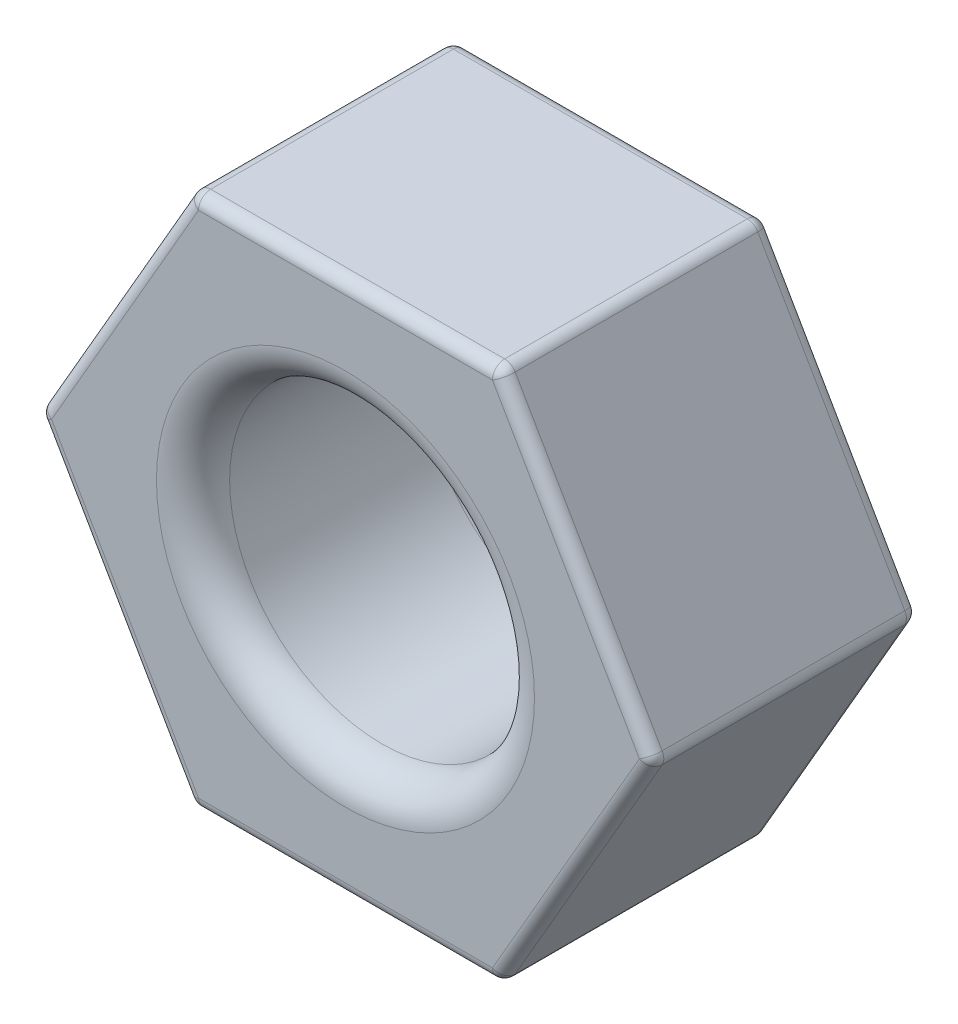
ISO-10303-21;
HEADER;
FILE_DESCRIPTION(('STEP AP214'),'2;1');
FILE_NAME('part.step','',(''),(''),'','','');
FILE_SCHEMA(('AUTOMOTIVE_DESIGN { 1 0 10303 214 1 1 1 1 }'));
ENDSEC;
DATA;
#1=APPLICATION_CONTEXT('core data for automotive mechanical design processes');
#2=APPLICATION_PROTOCOL_DEFINITION('international standard','automotive_design',2000,#1);
#3=PRODUCT_CONTEXT('',#1,'mechanical');
#4=PRODUCT('Part','Part','',(#3));
#5=PRODUCT_RELATED_PRODUCT_CATEGORY('part','',(#4));
#6=PRODUCT_DEFINITION_FORMATION('','',#4);
#7=PRODUCT_DEFINITION_CONTEXT('part definition',#1,'design');
#8=PRODUCT_DEFINITION('design','',#6,#7);
#9=PRODUCT_DEFINITION_SHAPE('','',#8);
#10=(LENGTH_UNIT() NAMED_UNIT(*) SI_UNIT(.MILLI.,.METRE.));
#11=(NAMED_UNIT(*) PLANE_ANGLE_UNIT() SI_UNIT($,.RADIAN.));
#12=(NAMED_UNIT(*) SI_UNIT($,.STERADIAN.) SOLID_ANGLE_UNIT());
#13=UNCERTAINTY_MEASURE_WITH_UNIT(LENGTH_MEASURE(1.E-05),#10,'distance_accuracy_value','');
#14=(GEOMETRIC_REPRESENTATION_CONTEXT(3) GLOBAL_UNCERTAINTY_ASSIGNED_CONTEXT((#13)) GLOBAL_UNIT_ASSIGNED_CONTEXT((#10,
#11,#12)) REPRESENTATION_CONTEXT('',''));
#15=CARTESIAN_POINT('',(0.,0.,0.));
#16=DIRECTION('',(0.,0.,1.));
#17=DIRECTION('',(1.,0.,0.));
#18=AXIS2_PLACEMENT_3D('',#15,#16,#17);
#19=CARTESIAN_POINT('',(0.,0.,5.5626));
#20=DIRECTION('',(0.,0.,1.));
#21=DIRECTION('',(1.,0.,0.));
#22=AXIS2_PLACEMENT_3D('',#19,#20,#21);
#23=PLANE('',#22);
#24=CARTESIAN_POINT('',(0.,0.,5.5626));
#25=DIRECTION('',(0.,0.,1.));
#26=DIRECTION('',(1.,0.,0.));
#27=AXIS2_PLACEMENT_3D('',#24,#25,#26);
#28=CIRCLE('',#27,3.937);
#29=CARTESIAN_POINT('',(3.937,0.,5.5626));
#30=VERTEX_POINT('',#29);
#31=EDGE_CURVE('E41',#30,#30,#28,.F.);
#32=ORIENTED_EDGE('',*,*,#31,.T.);
#33=EDGE_LOOP('',(#32));
#34=FACE_BOUND('',#33,.T.);
#35=DIRECTION('',(1.,0.,0.));
#36=VECTOR('',#35,1.);
#37=CARTESIAN_POINT('',(3.20790243318485,-5.30225000000001,5.5626));
#38=LINE('',#37,#36);
#39=CARTESIAN_POINT('',(-3.06125546481072,-5.30224999999999,5.5626));
#40=VERTEX_POINT('',#39);
#41=CARTESIAN_POINT('',(3.06125546481068,-5.30225000000001,5.5626));
#42=VERTEX_POINT('',#41);
#43=EDGE_CURVE('E48',#40,#42,#38,.T.);
#44=ORIENTED_EDGE('',*,*,#43,.T.);
#45=DIRECTION('',(0.500000000000001,0.866025403784438,0.));
#46=VECTOR('',#45,1.);
#47=CARTESIAN_POINT('',(6.19583441380847,0.127,5.5626));
#48=LINE('',#47,#46);
#49=CARTESIAN_POINT('',(6.12251092962139,0.,5.5626));
#50=VERTEX_POINT('',#49);
#51=EDGE_CURVE('E272',#42,#50,#48,.T.);
#52=ORIENTED_EDGE('',*,*,#51,.T.);
#53=DIRECTION('',(-0.499999999999995,0.866025403784442,0.));
#54=VECTOR('',#53,1.);
#55=CARTESIAN_POINT('',(2.98793198062368,5.42924999999997,5.5626));
#56=LINE('',#55,#54);
#57=CARTESIAN_POINT('',(3.06125546481076,5.30224999999997,5.5626));
#58=VERTEX_POINT('',#57);
#59=EDGE_CURVE('E400',#50,#58,#56,.T.);
#60=ORIENTED_EDGE('',*,*,#59,.T.);
#61=DIRECTION('',(-1.,0.,0.));
#62=VECTOR('',#61,1.);
#63=CARTESIAN_POINT('',(-3.20790243318481,5.30225000000004,5.5626));
#64=LINE('',#63,#62);
#65=CARTESIAN_POINT('',(-3.06125546481065,5.30225000000003,5.5626));
#66=VERTEX_POINT('',#65);
#67=EDGE_CURVE('E402',#58,#66,#64,.T.);
#68=ORIENTED_EDGE('',*,*,#67,.T.);
#69=DIRECTION('',(-0.500000000000008,-0.866025403784434,0.));
#70=VECTOR('',#69,1.);
#71=CARTESIAN_POINT('',(-6.19583441380848,-0.126999999999954,5.5626));
#72=LINE('',#71,#70);
#73=CARTESIAN_POINT('',(-6.12251092962139,0.,5.5626));
#74=VERTEX_POINT('',#73);
#75=EDGE_CURVE('E404',#66,#74,#72,.T.);
#76=ORIENTED_EDGE('',*,*,#75,.T.);
#77=DIRECTION('',(0.499999999999995,-0.866025403784442,0.));
#78=VECTOR('',#77,1.);
#79=CARTESIAN_POINT('',(-2.98793198062364,-5.42924999999999,5.5626));
#80=LINE('',#79,#78);
#81=EDGE_CURVE('E53',#74,#40,#80,.T.);
#82=ORIENTED_EDGE('',*,*,#81,.T.);
#83=EDGE_LOOP('',(#44,#52,#60,#68,#76,#82));
#84=FACE_BOUND('',#83,.T.);
#85=ADVANCED_FACE('F33',(#34,#84),#23,.T.);
#86=CARTESIAN_POINT('',(0.,0.,0.));
#87=DIRECTION('',(0.,0.,1.));
#88=DIRECTION('',(1.,0.,0.));
#89=AXIS2_PLACEMENT_3D('',#86,#87,#88);
#90=PLANE('',#89);
#91=CARTESIAN_POINT('',(0.,0.,0.));
#92=DIRECTION('',(0.,0.,1.));
#93=DIRECTION('',(1.,0.,0.));
#94=AXIS2_PLACEMENT_3D('',#91,#92,#93);
#95=CIRCLE('',#94,3.937);
#96=CARTESIAN_POINT('',(3.937,0.,0.));
#97=VERTEX_POINT('',#96);
#98=EDGE_CURVE('E11',#97,#97,#95,.T.);
#99=ORIENTED_EDGE('',*,*,#98,.T.);
#100=EDGE_LOOP('',(#99));
#101=FACE_BOUND('',#100,.T.);
#102=DIRECTION('',(1.,0.,0.));
#103=VECTOR('',#102,1.);
#104=CARTESIAN_POINT('',(0.,-5.30225,0.));
#105=LINE('',#104,#103);
#106=CARTESIAN_POINT('',(3.06125546481068,-5.30225000000001,0.));
#107=VERTEX_POINT('',#106);
#108=CARTESIAN_POINT('',(-3.06125546481072,-5.30224999999999,0.));
#109=VERTEX_POINT('',#108);
#110=EDGE_CURVE('E303',#107,#109,#105,.F.);
#111=ORIENTED_EDGE('',*,*,#110,.T.);
#112=DIRECTION('',(0.499999999999995,-0.866025403784442,0.));
#113=VECTOR('',#112,1.);
#114=CARTESIAN_POINT('',(-4.59188319721606,-2.65112499999997,0.));
#115=LINE('',#114,#113);
#116=CARTESIAN_POINT('',(-6.12251092962139,0.,0.));
#117=VERTEX_POINT('',#116);
#118=EDGE_CURVE('E306',#109,#117,#115,.F.);
#119=ORIENTED_EDGE('',*,*,#118,.T.);
#120=DIRECTION('',(-0.500000000000008,-0.866025403784434,0.));
#121=VECTOR('',#120,1.);
#122=CARTESIAN_POINT('',(-4.59188319721602,2.65112500000004,0.));
#123=LINE('',#122,#121);
#124=CARTESIAN_POINT('',(-3.06125546481065,5.30225000000003,0.));
#125=VERTEX_POINT('',#124);
#126=EDGE_CURVE('E346',#117,#125,#123,.F.);
#127=ORIENTED_EDGE('',*,*,#126,.T.);
#128=DIRECTION('',(-1.,0.,0.));
#129=VECTOR('',#128,1.);
#130=CARTESIAN_POINT('',(0.,5.30225,0.));
#131=LINE('',#130,#129);
#132=CARTESIAN_POINT('',(3.06125546481076,5.30224999999997,0.));
#133=VERTEX_POINT('',#132);
#134=EDGE_CURVE('E350',#125,#133,#131,.F.);
#135=ORIENTED_EDGE('',*,*,#134,.T.);
#136=DIRECTION('',(-0.499999999999995,0.866025403784442,0.));
#137=VECTOR('',#136,1.);
#138=CARTESIAN_POINT('',(4.59188319721608,2.65112499999998,0.));
#139=LINE('',#138,#137);
#140=CARTESIAN_POINT('',(6.12251092962139,0.,0.));
#141=VERTEX_POINT('',#140);
#142=EDGE_CURVE('E352',#133,#141,#139,.F.);
#143=ORIENTED_EDGE('',*,*,#142,.T.);
#144=DIRECTION('',(0.500000000000001,0.866025403784438,0.));
#145=VECTOR('',#144,1.);
#146=CARTESIAN_POINT('',(4.59188319721604,-2.65112500000001,0.));
#147=LINE('',#146,#145);
#148=EDGE_CURVE('E308',#141,#107,#147,.F.);
#149=ORIENTED_EDGE('',*,*,#148,.T.);
#150=EDGE_LOOP('',(#111,#119,#127,#135,#143,#149));
#151=FACE_BOUND('',#150,.T.);
#152=ADVANCED_FACE('F296',(#101,#151),#90,.F.);
#153=CARTESIAN_POINT('',(6.41580486636972,0.,5.5626));
#154=DIRECTION('',(-0.866025403784441,-0.499999999999995,0.));
#155=DIRECTION('',(0.499999999999995,-0.866025403784442,0.));
#156=AXIS2_PLACEMENT_3D('',#153,#154,#155);
#157=PLANE('',#156);
#158=DIRECTION('',(0.,0.,-1.));
#159=VECTOR('',#158,1.);
#160=CARTESIAN_POINT('',(6.34248138218264,0.126999999999999,5.5626));
#161=LINE('',#160,#159);
#162=CARTESIAN_POINT('',(6.34248138218264,0.126999999999999,5.3086));
#163=VERTEX_POINT('',#162);
#164=CARTESIAN_POINT('',(6.34248138218264,0.126999999999999,0.254));
#165=VERTEX_POINT('',#164);
#166=EDGE_CURVE('E375',#163,#165,#161,.T.);
#167=ORIENTED_EDGE('',*,*,#166,.T.);
#168=DIRECTION('',(-0.499999999999995,0.866025403784442,0.));
#169=VECTOR('',#168,1.);
#170=CARTESIAN_POINT('',(6.41580486636972,0.,0.254));
#171=LINE('',#170,#169);
#172=CARTESIAN_POINT('',(3.28122591737201,5.42924999999997,0.254));
#173=VERTEX_POINT('',#172);
#174=EDGE_CURVE('E379',#165,#173,#171,.T.);
#175=ORIENTED_EDGE('',*,*,#174,.T.);
#176=DIRECTION('',(0.,0.,-1.));
#177=VECTOR('',#176,1.);
#178=CARTESIAN_POINT('',(3.28122591737201,5.42924999999997,5.5626));
#179=LINE('',#178,#177);
#180=CARTESIAN_POINT('',(3.28122591737201,5.42924999999997,5.3086));
#181=VERTEX_POINT('',#180);
#182=EDGE_CURVE('E377',#173,#181,#179,.F.);
#183=ORIENTED_EDGE('',*,*,#182,.T.);
#184=DIRECTION('',(-0.499999999999995,0.866025403784442,0.));
#185=VECTOR('',#184,1.);
#186=CARTESIAN_POINT('',(6.41580486636972,0.,5.3086));
#187=LINE('',#186,#185);
#188=EDGE_CURVE('E373',#181,#163,#187,.F.);
#189=ORIENTED_EDGE('',*,*,#188,.T.);
#190=EDGE_LOOP('',(#167,#175,#183,#189));
#191=FACE_BOUND('',#190,.T.);
#192=ADVANCED_FACE('F299',(#191),#157,.F.);
#193=CARTESIAN_POINT('',(3.20790243318493,5.55624999999997,5.5626));
#194=DIRECTION('',(0.,-1.,0.));
#195=DIRECTION('',(1.,0.,0.));
#196=AXIS2_PLACEMENT_3D('',#193,#194,#195);
#197=PLANE('',#196);
#198=DIRECTION('',(0.,0.,-1.));
#199=VECTOR('',#198,1.);
#200=CARTESIAN_POINT('',(3.06125546481076,5.55624999999997,5.5626));
#201=LINE('',#200,#199);
#202=CARTESIAN_POINT('',(3.06125546481076,5.55624999999997,5.3086));
#203=VERTEX_POINT('',#202);
#204=CARTESIAN_POINT('',(3.06125546481076,5.55624999999997,0.254));
#205=VERTEX_POINT('',#204);
#206=EDGE_CURVE('E384',#203,#205,#201,.T.);
#207=ORIENTED_EDGE('',*,*,#206,.T.);
#208=DIRECTION('',(-1.,0.,0.));
#209=VECTOR('',#208,1.);
#210=CARTESIAN_POINT('',(3.20790243318493,5.55624999999997,0.254));
#211=LINE('',#210,#209);
#212=CARTESIAN_POINT('',(-3.06125546481064,5.55625000000003,0.254));
#213=VERTEX_POINT('',#212);
#214=EDGE_CURVE('E388',#205,#213,#211,.T.);
#215=ORIENTED_EDGE('',*,*,#214,.T.);
#216=DIRECTION('',(0.,0.,-1.));
#217=VECTOR('',#216,1.);
#218=CARTESIAN_POINT('',(-3.06125546481064,5.55625000000003,5.5626));
#219=LINE('',#218,#217);
#220=CARTESIAN_POINT('',(-3.06125546481064,5.55625000000003,5.3086));
#221=VERTEX_POINT('',#220);
#222=EDGE_CURVE('E386',#213,#221,#219,.F.);
#223=ORIENTED_EDGE('',*,*,#222,.T.);
#224=DIRECTION('',(-1.,0.,0.));
#225=VECTOR('',#224,1.);
#226=CARTESIAN_POINT('',(3.20790243318493,5.55624999999997,5.3086));
#227=LINE('',#226,#225);
#228=EDGE_CURVE('E382',#221,#203,#227,.F.);
#229=ORIENTED_EDGE('',*,*,#228,.T.);
#230=EDGE_LOOP('',(#207,#215,#223,#229));
#231=FACE_BOUND('',#230,.T.);
#232=ADVANCED_FACE('F495',(#231),#197,.F.);
#233=CARTESIAN_POINT('',(-3.20790243318481,5.55625000000003,5.5626));
#234=DIRECTION('',(0.866025403784434,-0.500000000000008,0.));
#235=DIRECTION('',(0.500000000000008,0.866025403784434,0.));
#236=AXIS2_PLACEMENT_3D('',#233,#234,#235);
#237=PLANE('',#236);
#238=DIRECTION('',(0.,0.,-1.));
#239=VECTOR('',#238,1.);
#240=CARTESIAN_POINT('',(-3.28122591737189,5.42925000000004,5.5626));
#241=LINE('',#240,#239);
#242=CARTESIAN_POINT('',(-3.28122591737189,5.42925000000004,5.3086));
#243=VERTEX_POINT('',#242);
#244=CARTESIAN_POINT('',(-3.28122591737189,5.42925000000004,0.254));
#245=VERTEX_POINT('',#244);
#246=EDGE_CURVE('E393',#243,#245,#241,.T.);
#247=ORIENTED_EDGE('',*,*,#246,.T.);
#248=DIRECTION('',(-0.500000000000008,-0.866025403784434,0.));
#249=VECTOR('',#248,1.);
#250=CARTESIAN_POINT('',(-3.20790243318481,5.55625000000003,0.254));
#251=LINE('',#250,#249);
#252=CARTESIAN_POINT('',(-6.34248138218264,0.127000000000048,0.254));
#253=VERTEX_POINT('',#252);
#254=EDGE_CURVE('E397',#245,#253,#251,.T.);
#255=ORIENTED_EDGE('',*,*,#254,.T.);
#256=DIRECTION('',(0.,0.,-1.));
#257=VECTOR('',#256,1.);
#258=CARTESIAN_POINT('',(-6.34248138218264,0.127000000000048,5.5626));
#259=LINE('',#258,#257);
#260=CARTESIAN_POINT('',(-6.34248138218264,0.127000000000048,5.3086));
#261=VERTEX_POINT('',#260);
#262=EDGE_CURVE('E395',#253,#261,#259,.F.);
#263=ORIENTED_EDGE('',*,*,#262,.T.);
#264=DIRECTION('',(-0.500000000000008,-0.866025403784434,0.));
#265=VECTOR('',#264,1.);
#266=CARTESIAN_POINT('',(-3.20790243318481,5.55625000000003,5.3086));
#267=LINE('',#266,#265);
#268=EDGE_CURVE('E391',#261,#243,#267,.F.);
#269=ORIENTED_EDGE('',*,*,#268,.T.);
#270=EDGE_LOOP('',(#247,#255,#263,#269));
#271=FACE_BOUND('',#270,.T.);
#272=ADVANCED_FACE('F469',(#271),#237,.F.);
#273=CARTESIAN_POINT('',(-6.41580486636972,0.,5.5626));
#274=DIRECTION('',(0.866025403784441,0.499999999999995,0.));
#275=DIRECTION('',(-0.499999999999995,0.866025403784442,0.));
#276=AXIS2_PLACEMENT_3D('',#273,#274,#275);
#277=PLANE('',#276);
#278=DIRECTION('',(0.,0.,-1.));
#279=VECTOR('',#278,1.);
#280=CARTESIAN_POINT('',(-6.34248138218264,-0.126999999999953,5.5626));
#281=LINE('',#280,#279);
#282=CARTESIAN_POINT('',(-6.34248138218264,-0.126999999999953,5.3086));
#283=VERTEX_POINT('',#282);
#284=CARTESIAN_POINT('',(-6.34248138218264,-0.126999999999953,0.254));
#285=VERTEX_POINT('',#284);
#286=EDGE_CURVE('E167',#283,#285,#281,.T.);
#287=ORIENTED_EDGE('',*,*,#286,.T.);
#288=DIRECTION('',(0.499999999999995,-0.866025403784442,0.));
#289=VECTOR('',#288,1.);
#290=CARTESIAN_POINT('',(-6.41580486636972,0.,0.254));
#291=LINE('',#290,#289);
#292=CARTESIAN_POINT('',(-3.28122591737197,-5.42924999999999,0.254));
#293=VERTEX_POINT('',#292);
#294=EDGE_CURVE('E163',#285,#293,#291,.T.);
#295=ORIENTED_EDGE('',*,*,#294,.T.);
#296=DIRECTION('',(0.,0.,-1.));
#297=VECTOR('',#296,1.);
#298=CARTESIAN_POINT('',(-3.28122591737197,-5.42924999999999,5.5626));
#299=LINE('',#298,#297);
#300=CARTESIAN_POINT('',(-3.28122591737197,-5.42924999999999,5.3086));
#301=VERTEX_POINT('',#300);
#302=EDGE_CURVE('E157',#293,#301,#299,.F.);
#303=ORIENTED_EDGE('',*,*,#302,.T.);
#304=DIRECTION('',(0.499999999999995,-0.866025403784442,0.));
#305=VECTOR('',#304,1.);
#306=CARTESIAN_POINT('',(-6.41580486636972,0.,5.3086));
#307=LINE('',#306,#305);
#308=EDGE_CURVE('E160',#301,#283,#307,.F.);
#309=ORIENTED_EDGE('',*,*,#308,.T.);
#310=EDGE_LOOP('',(#287,#295,#303,#309));
#311=FACE_BOUND('',#310,.T.);
#312=ADVANCED_FACE('F159',(#311),#277,.F.);
#313=CARTESIAN_POINT('',(-3.20790243318489,-5.55624999999999,5.5626));
#314=DIRECTION('',(0.,1.,0.));
#315=DIRECTION('',(-1.,0.,0.));
#316=AXIS2_PLACEMENT_3D('',#313,#314,#315);
#317=PLANE('',#316);
#318=DIRECTION('',(0.,0.,-1.));
#319=VECTOR('',#318,1.);
#320=CARTESIAN_POINT('',(-3.06125546481072,-5.55624999999999,5.5626));
#321=LINE('',#320,#319);
#322=CARTESIAN_POINT('',(-3.06125546481072,-5.55624999999999,5.3086));
#323=VERTEX_POINT('',#322);
#324=CARTESIAN_POINT('',(-3.06125546481072,-5.55624999999999,0.254));
#325=VERTEX_POINT('',#324);
#326=EDGE_CURVE('E189',#323,#325,#321,.T.);
#327=ORIENTED_EDGE('',*,*,#326,.T.);
#328=DIRECTION('',(1.,0.,0.));
#329=VECTOR('',#328,1.);
#330=CARTESIAN_POINT('',(-3.20790243318489,-5.55624999999999,0.254));
#331=LINE('',#330,#329);
#332=CARTESIAN_POINT('',(3.06125546481068,-5.55625000000001,0.254));
#333=VERTEX_POINT('',#332);
#334=EDGE_CURVE('E317',#325,#333,#331,.T.);
#335=ORIENTED_EDGE('',*,*,#334,.T.);
#336=DIRECTION('',(0.,0.,-1.));
#337=VECTOR('',#336,1.);
#338=CARTESIAN_POINT('',(3.06125546481068,-5.55625000000001,5.5626));
#339=LINE('',#338,#337);
#340=CARTESIAN_POINT('',(3.06125546481068,-5.55625000000001,5.3086));
#341=VERTEX_POINT('',#340);
#342=EDGE_CURVE('E360',#333,#341,#339,.F.);
#343=ORIENTED_EDGE('',*,*,#342,.T.);
#344=DIRECTION('',(1.,0.,0.));
#345=VECTOR('',#344,1.);
#346=CARTESIAN_POINT('',(-3.20790243318489,-5.55624999999999,5.3086));
#347=LINE('',#346,#345);
#348=EDGE_CURVE('E328',#341,#323,#347,.F.);
#349=ORIENTED_EDGE('',*,*,#348,.T.);
#350=EDGE_LOOP('',(#327,#335,#343,#349));
#351=FACE_BOUND('',#350,.T.);
#352=ADVANCED_FACE('F422',(#351),#317,.F.);
#353=CARTESIAN_POINT('',(3.20790243318485,-5.55625000000001,5.5626));
#354=DIRECTION('',(-0.866025403784438,0.500000000000001,0.));
#355=DIRECTION('',(-0.500000000000001,-0.866025403784438,0.));
#356=AXIS2_PLACEMENT_3D('',#353,#354,#355);
#357=PLANE('',#356);
#358=DIRECTION('',(0.,0.,-1.));
#359=VECTOR('',#358,1.);
#360=CARTESIAN_POINT('',(3.28122591737193,-5.42925000000001,5.5626));
#361=LINE('',#360,#359);
#362=CARTESIAN_POINT('',(3.28122591737193,-5.42925000000001,5.3086));
#363=VERTEX_POINT('',#362);
#364=CARTESIAN_POINT('',(3.28122591737193,-5.42925000000001,0.254));
#365=VERTEX_POINT('',#364);
#366=EDGE_CURVE('E368',#363,#365,#361,.T.);
#367=ORIENTED_EDGE('',*,*,#366,.T.);
#368=DIRECTION('',(0.500000000000001,0.866025403784438,0.));
#369=VECTOR('',#368,1.);
#370=CARTESIAN_POINT('',(3.20790243318485,-5.55625000000001,0.254));
#371=LINE('',#370,#369);
#372=CARTESIAN_POINT('',(6.34248138218264,-0.127,0.254));
#373=VERTEX_POINT('',#372);
#374=EDGE_CURVE('E370',#365,#373,#371,.T.);
#375=ORIENTED_EDGE('',*,*,#374,.T.);
#376=DIRECTION('',(0.,0.,-1.));
#377=VECTOR('',#376,1.);
#378=CARTESIAN_POINT('',(6.34248138218264,-0.127,5.5626));
#379=LINE('',#378,#377);
#380=CARTESIAN_POINT('',(6.34248138218264,-0.127,5.3086));
#381=VERTEX_POINT('',#380);
#382=EDGE_CURVE('E366',#373,#381,#379,.F.);
#383=ORIENTED_EDGE('',*,*,#382,.T.);
#384=DIRECTION('',(0.500000000000001,0.866025403784438,0.));
#385=VECTOR('',#384,1.);
#386=CARTESIAN_POINT('',(3.20790243318485,-5.55625000000001,5.3086));
#387=LINE('',#386,#385);
#388=EDGE_CURVE('E364',#381,#363,#387,.F.);
#389=ORIENTED_EDGE('',*,*,#388,.T.);
#390=EDGE_LOOP('',(#367,#375,#383,#389));
#391=FACE_BOUND('',#390,.T.);
#392=ADVANCED_FACE('F288',(#391),#357,.F.);
#393=CARTESIAN_POINT('',(0.,0.,5.5626));
#394=DIRECTION('',(0.,0.,-1.));
#395=DIRECTION('',(-1.,0.,0.));
#396=AXIS2_PLACEMENT_3D('',#393,#394,#395);
#397=CYLINDRICAL_SURFACE('',#396,3.175);
#398=CARTESIAN_POINT('',(0.,0.,4.8006));
#399=DIRECTION('',(0.,0.,1.));
#400=DIRECTION('',(1.,0.,0.));
#401=AXIS2_PLACEMENT_3D('',#398,#399,#400);
#402=CIRCLE('',#401,3.175);
#403=CARTESIAN_POINT('',(-3.175,0.,4.8006));
#404=VERTEX_POINT('',#403);
#405=EDGE_CURVE('E271',#404,#404,#402,.T.);
#406=CARTESIAN_POINT('',(0.,0.,0.762));
#407=DIRECTION('',(0.,0.,1.));
#408=DIRECTION('',(1.,0.,0.));
#409=AXIS2_PLACEMENT_3D('',#406,#407,#408);
#410=CIRCLE('',#409,3.175);
#411=CARTESIAN_POINT('',(-3.175,0.,0.761999999999999));
#412=VERTEX_POINT('',#411);
#413=EDGE_CURVE('E268',#412,#412,#410,.F.);
#414=CARTESIAN_POINT('',(-3.175,0.,4.8006));
#415=CARTESIAN_POINT('',(-3.175,0.,4.75853125));
#416=CARTESIAN_POINT('',(-3.175,0.,4.7164625));
#417=CARTESIAN_POINT('',(-3.175,0.,4.632325));
#418=CARTESIAN_POINT('',(-3.175,0.,4.59025625));
#419=CARTESIAN_POINT('',(-3.175,0.,4.50611875));
#420=CARTESIAN_POINT('',(-3.175,0.,4.46405));
#421=CARTESIAN_POINT('',(-3.175,0.,4.3799125));
#422=CARTESIAN_POINT('',(-3.175,0.,4.33784375));
#423=CARTESIAN_POINT('',(-3.175,0.,4.25370625));
#424=CARTESIAN_POINT('',(-3.175,0.,4.2116375));
#425=CARTESIAN_POINT('',(-3.175,0.,4.1275));
#426=CARTESIAN_POINT('',(-3.175,0.,4.08543125));
#427=CARTESIAN_POINT('',(-3.175,0.,4.00129375));
#428=CARTESIAN_POINT('',(-3.175,0.,3.959225));
#429=CARTESIAN_POINT('',(-3.175,0.,3.8750875));
#430=CARTESIAN_POINT('',(-3.175,0.,3.83301875));
#431=CARTESIAN_POINT('',(-3.175,0.,3.74888125));
#432=CARTESIAN_POINT('',(-3.175,0.,3.7068125));
#433=CARTESIAN_POINT('',(-3.175,0.,3.622675));
#434=CARTESIAN_POINT('',(-3.175,0.,3.58060625));
#435=CARTESIAN_POINT('',(-3.175,0.,3.49646875));
#436=CARTESIAN_POINT('',(-3.175,0.,3.4544));
#437=CARTESIAN_POINT('',(-3.175,0.,3.3702625));
#438=CARTESIAN_POINT('',(-3.175,0.,3.32819375));
#439=CARTESIAN_POINT('',(-3.175,0.,3.24405625));
#440=CARTESIAN_POINT('',(-3.175,0.,3.2019875));
#441=CARTESIAN_POINT('',(-3.175,0.,3.11785));
#442=CARTESIAN_POINT('',(-3.175,0.,3.07578125));
#443=CARTESIAN_POINT('',(-3.175,0.,2.99164375));
#444=CARTESIAN_POINT('',(-3.175,0.,2.949575));
#445=CARTESIAN_POINT('',(-3.175,0.,2.8654375));
#446=CARTESIAN_POINT('',(-3.175,0.,2.82336875));
#447=CARTESIAN_POINT('',(-3.175,0.,2.73923125));
#448=CARTESIAN_POINT('',(-3.175,0.,2.6971625));
#449=CARTESIAN_POINT('',(-3.175,0.,2.613025));
#450=CARTESIAN_POINT('',(-3.175,0.,2.57095625));
#451=CARTESIAN_POINT('',(-3.175,0.,2.48681875));
#452=CARTESIAN_POINT('',(-3.175,0.,2.44475));
#453=CARTESIAN_POINT('',(-3.175,0.,2.3606125));
#454=CARTESIAN_POINT('',(-3.175,0.,2.31854375));
#455=CARTESIAN_POINT('',(-3.175,0.,2.23440625));
#456=CARTESIAN_POINT('',(-3.175,0.,2.1923375));
#457=CARTESIAN_POINT('',(-3.175,0.,2.1082));
#458=CARTESIAN_POINT('',(-3.175,0.,2.06613125));
#459=CARTESIAN_POINT('',(-3.175,0.,1.98199375));
#460=CARTESIAN_POINT('',(-3.175,0.,1.939925));
#461=CARTESIAN_POINT('',(-3.175,0.,1.8557875));
#462=CARTESIAN_POINT('',(-3.175,0.,1.81371875));
#463=CARTESIAN_POINT('',(-3.175,0.,1.72958125));
#464=CARTESIAN_POINT('',(-3.175,0.,1.6875125));
#465=CARTESIAN_POINT('',(-3.175,0.,1.603375));
#466=CARTESIAN_POINT('',(-3.175,0.,1.56130625));
#467=CARTESIAN_POINT('',(-3.175,0.,1.47716875));
#468=CARTESIAN_POINT('',(-3.175,0.,1.4351));
#469=CARTESIAN_POINT('',(-3.175,0.,1.3509625));
#470=CARTESIAN_POINT('',(-3.175,0.,1.30889375));
#471=CARTESIAN_POINT('',(-3.175,0.,1.22475625));
#472=CARTESIAN_POINT('',(-3.175,0.,1.1826875));
#473=CARTESIAN_POINT('',(-3.175,0.,1.09855));
#474=CARTESIAN_POINT('',(-3.175,0.,1.05648125));
#475=CARTESIAN_POINT('',(-3.175,0.,0.972343749999999));
#476=CARTESIAN_POINT('',(-3.175,0.,0.930274999999999));
#477=CARTESIAN_POINT('',(-3.175,0.,0.846137499999999));
#478=CARTESIAN_POINT('',(-3.175,0.,0.804068749999999));
#479=CARTESIAN_POINT('',(-3.175,0.,0.761999999999999));
#480=B_SPLINE_CURVE_WITH_KNOTS('',3,(#414,#415,#416,#417,#418,#419,#420,#421,#422,#423,#424,
#425,#426,#427,#428,#429,#430,#431,#432,#433,#434,#435,#436,#437,#438,#439,#440,#441,#442,#443,
#444,#445,#446,#447,#448,#449,#450,#451,#452,#453,#454,#455,#456,#457,#458,#459,#460,#461,#462,
#463,#464,#465,#466,#467,#468,#469,#470,#471,#472,#473,#474,#475,#476,#477,#478,#479),
.UNSPECIFIED.,.F.,.F.,(4,2,2,2,2,2,2,2,2,2,2,2,2,2,2,2,2,2,2,2,2,2,2,2,2,2,2,2,2,2,2,2,4),(0.,
0.12620625,0.252412499999999,0.378618749999999,0.504825,0.63103125,0.7572375,0.88344375,1.00965,
1.13585625,1.2620625,1.38826875,1.514475,1.64068125,1.7668875,1.89309375,2.0193,2.14550625,
2.2717125,2.39791875,2.524125,2.65033125,2.7765375,2.90274375,3.02895,3.15515625,3.2813625,
3.40756875,3.533775,3.65998125,3.7861875,3.91239375,4.0386),.UNSPECIFIED.);
#481=EDGE_CURVE('BSEAM284',#404,#412,#480,.T.);
#482=ORIENTED_EDGE('',*,*,#405,.T.);
#483=ORIENTED_EDGE('',*,*,#413,.T.);
#484=ORIENTED_EDGE('',*,*,#481,.T.);
#485=ORIENTED_EDGE('',*,*,#481,.F.);
#486=EDGE_LOOP('',(#482,#484,#483,#485));
#487=FACE_BOUND('',#486,.T.);
#488=ADVANCED_FACE('F284',(#487),#397,.F.);
#489=CARTESIAN_POINT('',(4.59188319721608,2.65112499999998,5.3086));
#490=DIRECTION('',(0.499999999999995,-0.866025403784442,0.));
#491=DIRECTION('',(0.866025403784442,0.499999999999995,0.));
#492=AXIS2_PLACEMENT_3D('',#489,#490,#491);
#493=CYLINDRICAL_SURFACE('',#492,0.254);
#494=CARTESIAN_POINT('',(3.06125546481076,5.30224999999997,5.3086));
#495=DIRECTION('',(-0.499999999999995,0.866025403784441,0.));
#496=DIRECTION('',(-0.866025403784442,-0.499999999999995,0.));
#497=AXIS2_PLACEMENT_3D('',#494,#495,#496);
#498=CIRCLE('',#497,0.254);
#499=EDGE_CURVE('E178',#58,#181,#498,.T.);
#500=ORIENTED_EDGE('',*,*,#499,.F.);
#501=ORIENTED_EDGE('',*,*,#59,.F.);
#502=CARTESIAN_POINT('',(6.12251092962139,0.,5.3086));
#503=DIRECTION('',(0.499999999999995,-0.866025403784441,0.));
#504=DIRECTION('',(0.866025403784441,0.499999999999995,0.));
#505=AXIS2_PLACEMENT_3D('',#502,#503,#504);
#506=CIRCLE('',#505,0.254);
#507=EDGE_CURVE('E263',#163,#50,#506,.T.);
#508=ORIENTED_EDGE('',*,*,#507,.F.);
#509=ORIENTED_EDGE('',*,*,#188,.F.);
#510=EDGE_LOOP('',(#500,#501,#508,#509));
#511=FACE_BOUND('',#510,.T.);
#512=ADVANCED_FACE('F287',(#511),#493,.T.);
#513=CARTESIAN_POINT('',(3.06125546481076,5.30224999999997,5.3086));
#514=DIRECTION('',(0.,0.,1.));
#515=DIRECTION('',(1.,0.,0.));
#516=AXIS2_PLACEMENT_3D('',#513,#514,#515);
#517=SPHERICAL_SURFACE('',#516,0.254);
#518=CARTESIAN_POINT('',(3.06125546481076,5.30224999999997,5.3086));
#519=DIRECTION('',(1.,0.,0.));
#520=DIRECTION('',(0.,1.,0.));
#521=AXIS2_PLACEMENT_3D('',#518,#519,#520);
#522=CIRCLE('',#521,0.254);
#523=EDGE_CURVE('E257',#58,#203,#522,.F.);
#524=ORIENTED_EDGE('',*,*,#523,.F.);
#525=ORIENTED_EDGE('',*,*,#499,.T.);
#526=CARTESIAN_POINT('',(3.06125546481076,5.30224999999997,5.3086));
#527=DIRECTION('',(0.,0.,1.));
#528=DIRECTION('',(1.,0.,0.));
#529=AXIS2_PLACEMENT_3D('',#526,#527,#528);
#530=CIRCLE('',#529,0.254);
#531=EDGE_CURVE('E260',#203,#181,#530,.F.);
#532=ORIENTED_EDGE('',*,*,#531,.F.);
#533=EDGE_LOOP('',(#524,#525,#532));
#534=FACE_BOUND('',#533,.T.);
#535=ADVANCED_FACE('F451',(#534),#517,.T.);
#536=CARTESIAN_POINT('',(6.12251092962139,0.,5.3086));
#537=DIRECTION('',(0.,0.,1.));
#538=DIRECTION('',(1.,0.,0.));
#539=AXIS2_PLACEMENT_3D('',#536,#537,#538);
#540=SPHERICAL_SURFACE('',#539,0.254);
#541=CARTESIAN_POINT('',(6.12251092962139,0.,5.3086));
#542=DIRECTION('',(0.,0.,1.));
#543=DIRECTION('',(1.,0.,0.));
#544=AXIS2_PLACEMENT_3D('',#541,#542,#543);
#545=CIRCLE('',#544,0.254);
#546=EDGE_CURVE('E252',#163,#381,#545,.F.);
#547=ORIENTED_EDGE('',*,*,#546,.F.);
#548=ORIENTED_EDGE('',*,*,#507,.T.);
#549=CARTESIAN_POINT('',(6.12251092962139,0.,5.3086));
#550=DIRECTION('',(0.5,0.866025403784438,0.));
#551=DIRECTION('',(-0.866025403784438,0.5,0.));
#552=AXIS2_PLACEMENT_3D('',#549,#550,#551);
#553=CIRCLE('',#552,0.254);
#554=EDGE_CURVE('E255',#381,#50,#553,.F.);
#555=ORIENTED_EDGE('',*,*,#554,.F.);
#556=EDGE_LOOP('',(#547,#548,#555));
#557=FACE_BOUND('',#556,.T.);
#558=ADVANCED_FACE('F443',(#557),#540,.T.);
#559=CARTESIAN_POINT('',(3.06125546481076,5.30224999999997,5.5626));
#560=DIRECTION('',(0.,0.,-1.));
#561=DIRECTION('',(-1.,0.,0.));
#562=AXIS2_PLACEMENT_3D('',#559,#560,#561);
#563=CYLINDRICAL_SURFACE('',#562,0.254);
#564=ORIENTED_EDGE('',*,*,#531,.T.);
#565=ORIENTED_EDGE('',*,*,#182,.F.);
#566=CARTESIAN_POINT('',(3.06125546481076,5.30224999999997,0.254));
#567=DIRECTION('',(0.,0.,-1.));
#568=DIRECTION('',(-1.,0.,0.));
#569=AXIS2_PLACEMENT_3D('',#566,#567,#568);
#570=CIRCLE('',#569,0.254);
#571=EDGE_CURVE('E247',#205,#173,#570,.T.);
#572=ORIENTED_EDGE('',*,*,#571,.F.);
#573=ORIENTED_EDGE('',*,*,#206,.F.);
#574=EDGE_LOOP('',(#564,#565,#572,#573));
#575=FACE_BOUND('',#574,.T.);
#576=ADVANCED_FACE('F492',(#575),#563,.T.);
#577=CARTESIAN_POINT('',(0.,5.30225,5.3086));
#578=DIRECTION('',(1.,0.,0.));
#579=DIRECTION('',(0.,1.,0.));
#580=AXIS2_PLACEMENT_3D('',#577,#578,#579);
#581=CYLINDRICAL_SURFACE('',#580,0.254);
#582=ORIENTED_EDGE('',*,*,#523,.T.);
#583=ORIENTED_EDGE('',*,*,#228,.F.);
#584=CARTESIAN_POINT('',(-3.06125546481065,5.30225000000003,5.3086));
#585=DIRECTION('',(-1.,0.,0.));
#586=DIRECTION('',(0.,-1.,0.));
#587=AXIS2_PLACEMENT_3D('',#584,#585,#586);
#588=CIRCLE('',#587,0.254);
#589=EDGE_CURVE('E244',#66,#221,#588,.T.);
#590=ORIENTED_EDGE('',*,*,#589,.F.);
#591=ORIENTED_EDGE('',*,*,#67,.F.);
#592=EDGE_LOOP('',(#582,#583,#590,#591));
#593=FACE_BOUND('',#592,.T.);
#594=ADVANCED_FACE('F456',(#593),#581,.T.);
#595=CARTESIAN_POINT('',(4.59188319721604,-2.65112500000001,5.3086));
#596=DIRECTION('',(-0.500000000000001,-0.866025403784438,0.));
#597=DIRECTION('',(0.866025403784438,-0.500000000000001,0.));
#598=AXIS2_PLACEMENT_3D('',#595,#596,#597);
#599=CYLINDRICAL_SURFACE('',#598,0.254);
#600=ORIENTED_EDGE('',*,*,#554,.T.);
#601=ORIENTED_EDGE('',*,*,#51,.F.);
#602=CARTESIAN_POINT('',(3.06125546481068,-5.30225000000001,5.3086));
#603=DIRECTION('',(-0.500000000000001,-0.866025403784438,0.));
#604=DIRECTION('',(0.866025403784438,-0.500000000000001,0.));
#605=AXIS2_PLACEMENT_3D('',#602,#603,#604);
#606=CIRCLE('',#605,0.254);
#607=EDGE_CURVE('E241',#363,#42,#606,.T.);
#608=ORIENTED_EDGE('',*,*,#607,.F.);
#609=ORIENTED_EDGE('',*,*,#388,.F.);
#610=EDGE_LOOP('',(#600,#601,#608,#609));
#611=FACE_BOUND('',#610,.T.);
#612=ADVANCED_FACE('F410',(#611),#599,.T.);
#613=CARTESIAN_POINT('',(6.12251092962139,0.,5.5626));
#614=DIRECTION('',(0.,0.,-1.));
#615=DIRECTION('',(-1.,0.,0.));
#616=AXIS2_PLACEMENT_3D('',#613,#614,#615);
#617=CYLINDRICAL_SURFACE('',#616,0.254);
#618=ORIENTED_EDGE('',*,*,#546,.T.);
#619=ORIENTED_EDGE('',*,*,#382,.F.);
#620=CARTESIAN_POINT('',(6.12251092962139,0.,0.254));
#621=DIRECTION('',(0.,0.,-1.));
#622=DIRECTION('',(-1.,0.,0.));
#623=AXIS2_PLACEMENT_3D('',#620,#621,#622);
#624=CIRCLE('',#623,0.254);
#625=EDGE_CURVE('E238',#165,#373,#624,.T.);
#626=ORIENTED_EDGE('',*,*,#625,.F.);
#627=ORIENTED_EDGE('',*,*,#166,.F.);
#628=EDGE_LOOP('',(#618,#619,#626,#627));
#629=FACE_BOUND('',#628,.T.);
#630=ADVANCED_FACE('F440',(#629),#617,.T.);
#631=CARTESIAN_POINT('',(6.19583441380847,-0.126999999999999,0.254));
#632=DIRECTION('',(-0.499999999999995,0.866025403784442,0.));
#633=DIRECTION('',(-0.866025403784442,-0.499999999999995,0.));
#634=AXIS2_PLACEMENT_3D('',#631,#632,#633);
#635=CYLINDRICAL_SURFACE('',#634,0.254);
#636=CARTESIAN_POINT('',(3.06125546481076,5.30224999999997,0.254));
#637=DIRECTION('',(-0.499999999999994,0.866025403784442,0.));
#638=DIRECTION('',(-0.866025403784442,-0.499999999999994,0.));
#639=AXIS2_PLACEMENT_3D('',#636,#637,#638);
#640=CIRCLE('',#639,0.254);
#641=EDGE_CURVE('E249',#173,#133,#640,.T.);
#642=ORIENTED_EDGE('',*,*,#641,.F.);
#643=ORIENTED_EDGE('',*,*,#174,.F.);
#644=CARTESIAN_POINT('',(6.12251092962139,0.,0.254));
#645=DIRECTION('',(0.499999999999994,-0.866025403784442,0.));
#646=DIRECTION('',(0.866025403784442,0.499999999999995,0.));
#647=AXIS2_PLACEMENT_3D('',#644,#645,#646);
#648=CIRCLE('',#647,0.254);
#649=EDGE_CURVE('E235',#141,#165,#648,.T.);
#650=ORIENTED_EDGE('',*,*,#649,.F.);
#651=ORIENTED_EDGE('',*,*,#142,.F.);
#652=EDGE_LOOP('',(#642,#643,#650,#651));
#653=FACE_BOUND('',#652,.T.);
#654=ADVANCED_FACE('F485',(#653),#635,.T.);
#655=CARTESIAN_POINT('',(3.06125546481076,5.30224999999997,0.254));
#656=DIRECTION('',(0.,0.,1.));
#657=DIRECTION('',(1.,0.,0.));
#658=AXIS2_PLACEMENT_3D('',#655,#656,#657);
#659=SPHERICAL_SURFACE('',#658,0.254);
#660=ORIENTED_EDGE('',*,*,#571,.T.);
#661=ORIENTED_EDGE('',*,*,#641,.T.);
#662=CARTESIAN_POINT('',(3.06125546481076,5.30224999999997,0.254));
#663=DIRECTION('',(1.,0.,0.));
#664=DIRECTION('',(0.,1.,0.));
#665=AXIS2_PLACEMENT_3D('',#662,#663,#664);
#666=CIRCLE('',#665,0.254);
#667=EDGE_CURVE('E232',#205,#133,#666,.F.);
#668=ORIENTED_EDGE('',*,*,#667,.F.);
#669=EDGE_LOOP('',(#660,#661,#668));
#670=FACE_BOUND('',#669,.T.);
#671=ADVANCED_FACE('F489',(#670),#659,.T.);
#672=CARTESIAN_POINT('',(-3.06125546481065,5.30225000000003,5.3086));
#673=DIRECTION('',(0.,0.,1.));
#674=DIRECTION('',(1.,0.,0.));
#675=AXIS2_PLACEMENT_3D('',#672,#673,#674);
#676=SPHERICAL_SURFACE('',#675,0.254);
#677=CARTESIAN_POINT('',(-3.06125546481065,5.30225000000003,5.3086));
#678=DIRECTION('',(0.500000000000008,0.866025403784434,0.));
#679=DIRECTION('',(-0.866025403784434,0.500000000000008,0.));
#680=AXIS2_PLACEMENT_3D('',#677,#678,#679);
#681=CIRCLE('',#680,0.254);
#682=EDGE_CURVE('E226',#66,#243,#681,.F.);
#683=ORIENTED_EDGE('',*,*,#682,.F.);
#684=ORIENTED_EDGE('',*,*,#589,.T.);
#685=CARTESIAN_POINT('',(-3.06125546481065,5.30225000000003,5.3086));
#686=DIRECTION('',(0.,0.,1.));
#687=DIRECTION('',(1.,0.,0.));
#688=AXIS2_PLACEMENT_3D('',#685,#686,#687);
#689=CIRCLE('',#688,0.254);
#690=EDGE_CURVE('E229',#243,#221,#689,.F.);
#691=ORIENTED_EDGE('',*,*,#690,.F.);
#692=EDGE_LOOP('',(#683,#684,#691));
#693=FACE_BOUND('',#692,.T.);
#694=ADVANCED_FACE('F591',(#693),#676,.T.);
#695=CARTESIAN_POINT('',(3.06125546481068,-5.30225000000001,5.3086));
#696=DIRECTION('',(0.,0.,1.));
#697=DIRECTION('',(1.,0.,0.));
#698=AXIS2_PLACEMENT_3D('',#695,#696,#697);
#699=SPHERICAL_SURFACE('',#698,0.254);
#700=CARTESIAN_POINT('',(3.06125546481068,-5.30225000000001,5.3086));
#701=DIRECTION('',(0.,0.,1.));
#702=DIRECTION('',(1.,0.,0.));
#703=AXIS2_PLACEMENT_3D('',#700,#701,#702);
#704=CIRCLE('',#703,0.254);
#705=EDGE_CURVE('E220',#363,#341,#704,.F.);
#706=ORIENTED_EDGE('',*,*,#705,.F.);
#707=ORIENTED_EDGE('',*,*,#607,.T.);
#708=CARTESIAN_POINT('',(3.06125546481068,-5.30225000000001,5.3086));
#709=DIRECTION('',(1.,0.,0.));
#710=DIRECTION('',(0.,1.,0.));
#711=AXIS2_PLACEMENT_3D('',#708,#709,#710);
#712=CIRCLE('',#711,0.254);
#713=EDGE_CURVE('E223',#341,#42,#712,.F.);
#714=ORIENTED_EDGE('',*,*,#713,.F.);
#715=EDGE_LOOP('',(#706,#707,#714));
#716=FACE_BOUND('',#715,.T.);
#717=ADVANCED_FACE('F416',(#716),#699,.T.);
#718=CARTESIAN_POINT('',(6.12251092962139,0.,0.254));
#719=DIRECTION('',(0.,0.,1.));
#720=DIRECTION('',(1.,0.,0.));
#721=AXIS2_PLACEMENT_3D('',#718,#719,#720);
#722=SPHERICAL_SURFACE('',#721,0.254);
#723=ORIENTED_EDGE('',*,*,#649,.T.);
#724=ORIENTED_EDGE('',*,*,#625,.T.);
#725=CARTESIAN_POINT('',(6.12251092962139,0.,0.254));
#726=DIRECTION('',(0.500000000000001,0.866025403784438,0.));
#727=DIRECTION('',(-0.866025403784438,0.500000000000002,0.));
#728=AXIS2_PLACEMENT_3D('',#725,#726,#727);
#729=CIRCLE('',#728,0.254);
#730=EDGE_CURVE('E218',#141,#373,#729,.F.);
#731=ORIENTED_EDGE('',*,*,#730,.F.);
#732=EDGE_LOOP('',(#723,#724,#731));
#733=FACE_BOUND('',#732,.T.);
#734=ADVANCED_FACE('F436',(#733),#722,.T.);
#735=CARTESIAN_POINT('',(3.20790243318492,5.30224999999997,0.254));
#736=DIRECTION('',(-1.,0.,0.));
#737=DIRECTION('',(0.,-1.,0.));
#738=AXIS2_PLACEMENT_3D('',#735,#736,#737);
#739=CYLINDRICAL_SURFACE('',#738,0.254);
#740=ORIENTED_EDGE('',*,*,#667,.T.);
#741=ORIENTED_EDGE('',*,*,#134,.F.);
#742=CARTESIAN_POINT('',(-3.06125546481065,5.30225000000003,0.254));
#743=DIRECTION('',(-1.,0.,0.));
#744=DIRECTION('',(0.,-1.,0.));
#745=AXIS2_PLACEMENT_3D('',#742,#743,#744);
#746=CIRCLE('',#745,0.254);
#747=EDGE_CURVE('E215',#213,#125,#746,.T.);
#748=ORIENTED_EDGE('',*,*,#747,.F.);
#749=ORIENTED_EDGE('',*,*,#214,.F.);
#750=EDGE_LOOP('',(#740,#741,#748,#749));
#751=FACE_BOUND('',#750,.T.);
#752=ADVANCED_FACE('F480',(#751),#739,.T.);
#753=CARTESIAN_POINT('',(-3.06125546481065,5.30225000000003,5.5626));
#754=DIRECTION('',(0.,0.,-1.));
#755=DIRECTION('',(-1.,0.,0.));
#756=AXIS2_PLACEMENT_3D('',#753,#754,#755);
#757=CYLINDRICAL_SURFACE('',#756,0.254);
#758=ORIENTED_EDGE('',*,*,#690,.T.);
#759=ORIENTED_EDGE('',*,*,#222,.F.);
#760=CARTESIAN_POINT('',(-3.06125546481065,5.30225000000003,0.254));
#761=DIRECTION('',(0.,0.,-1.));
#762=DIRECTION('',(-1.,0.,0.));
#763=AXIS2_PLACEMENT_3D('',#760,#761,#762);
#764=CIRCLE('',#763,0.254);
#765=EDGE_CURVE('E213',#245,#213,#764,.T.);
#766=ORIENTED_EDGE('',*,*,#765,.F.);
#767=ORIENTED_EDGE('',*,*,#246,.F.);
#768=EDGE_LOOP('',(#758,#759,#766,#767));
#769=FACE_BOUND('',#768,.T.);
#770=ADVANCED_FACE('F474',(#769),#757,.T.);
#771=CARTESIAN_POINT('',(-4.59188319721602,2.65112500000004,5.3086));
#772=DIRECTION('',(0.500000000000008,0.866025403784434,0.));
#773=DIRECTION('',(-0.866025403784434,0.500000000000008,0.));
#774=AXIS2_PLACEMENT_3D('',#771,#772,#773);
#775=CYLINDRICAL_SURFACE('',#774,0.254);
#776=ORIENTED_EDGE('',*,*,#682,.T.);
#777=ORIENTED_EDGE('',*,*,#268,.F.);
#778=CARTESIAN_POINT('',(-6.12251092962139,0.,5.3086));
#779=DIRECTION('',(-0.500000000000007,-0.866025403784434,0.));
#780=DIRECTION('',(0.866025403784434,-0.500000000000007,0.));
#781=AXIS2_PLACEMENT_3D('',#778,#779,#780);
#782=CIRCLE('',#781,0.254);
#783=EDGE_CURVE('E210',#74,#261,#782,.T.);
#784=ORIENTED_EDGE('',*,*,#783,.F.);
#785=ORIENTED_EDGE('',*,*,#75,.F.);
#786=EDGE_LOOP('',(#776,#777,#784,#785));
#787=FACE_BOUND('',#786,.T.);
#788=ADVANCED_FACE('F462',(#787),#775,.T.);
#789=CARTESIAN_POINT('',(-4.59188319721606,-2.65112499999997,5.3086));
#790=DIRECTION('',(-0.499999999999995,0.866025403784442,0.));
#791=DIRECTION('',(-0.866025403784442,-0.499999999999995,0.));
#792=AXIS2_PLACEMENT_3D('',#789,#790,#791);
#793=CYLINDRICAL_SURFACE('',#792,0.254);
#794=CARTESIAN_POINT('',(-3.06125546481072,-5.30224999999999,5.3086));
#795=DIRECTION('',(0.499999999999995,-0.866025403784441,0.));
#796=DIRECTION('',(0.866025403784442,0.499999999999995,0.));
#797=AXIS2_PLACEMENT_3D('',#794,#795,#796);
#798=CIRCLE('',#797,0.254);
#799=EDGE_CURVE('E173',#40,#301,#798,.T.);
#800=ORIENTED_EDGE('',*,*,#799,.F.);
#801=ORIENTED_EDGE('',*,*,#81,.F.);
#802=CARTESIAN_POINT('',(-6.12251092962139,0.,5.3086));
#803=DIRECTION('',(-0.499999999999995,0.866025403784441,0.));
#804=DIRECTION('',(-0.866025403784441,-0.499999999999995,0.));
#805=AXIS2_PLACEMENT_3D('',#802,#803,#804);
#806=CIRCLE('',#805,0.254);
#807=EDGE_CURVE('E176',#283,#74,#806,.T.);
#808=ORIENTED_EDGE('',*,*,#807,.F.);
#809=ORIENTED_EDGE('',*,*,#308,.F.);
#810=EDGE_LOOP('',(#800,#801,#808,#809));
#811=FACE_BOUND('',#810,.T.);
#812=ADVANCED_FACE('F172',(#811),#793,.T.);
#813=CARTESIAN_POINT('',(0.,-5.30225,5.3086));
#814=DIRECTION('',(-1.,0.,0.));
#815=DIRECTION('',(0.,-1.,0.));
#816=AXIS2_PLACEMENT_3D('',#813,#814,#815);
#817=CYLINDRICAL_SURFACE('',#816,0.254);
#818=ORIENTED_EDGE('',*,*,#713,.T.);
#819=ORIENTED_EDGE('',*,*,#43,.F.);
#820=CARTESIAN_POINT('',(-3.06125546481072,-5.30224999999999,5.3086));
#821=DIRECTION('',(-1.,0.,0.));
#822=DIRECTION('',(0.,-1.,0.));
#823=AXIS2_PLACEMENT_3D('',#820,#821,#822);
#824=CIRCLE('',#823,0.254);
#825=EDGE_CURVE('E186',#323,#40,#824,.T.);
#826=ORIENTED_EDGE('',*,*,#825,.F.);
#827=ORIENTED_EDGE('',*,*,#348,.F.);
#828=EDGE_LOOP('',(#818,#819,#826,#827));
#829=FACE_BOUND('',#828,.T.);
#830=ADVANCED_FACE('F420',(#829),#817,.T.);
#831=CARTESIAN_POINT('',(3.06125546481068,-5.30225000000001,5.5626));
#832=DIRECTION('',(0.,0.,-1.));
#833=DIRECTION('',(-1.,0.,0.));
#834=AXIS2_PLACEMENT_3D('',#831,#832,#833);
#835=CYLINDRICAL_SURFACE('',#834,0.254);
#836=ORIENTED_EDGE('',*,*,#705,.T.);
#837=ORIENTED_EDGE('',*,*,#342,.F.);
#838=CARTESIAN_POINT('',(3.06125546481068,-5.30225000000001,0.254));
#839=DIRECTION('',(0.,0.,-1.));
#840=DIRECTION('',(-1.,0.,0.));
#841=AXIS2_PLACEMENT_3D('',#838,#839,#840);
#842=CIRCLE('',#841,0.254);
#843=EDGE_CURVE('E205',#365,#333,#842,.T.);
#844=ORIENTED_EDGE('',*,*,#843,.F.);
#845=ORIENTED_EDGE('',*,*,#366,.F.);
#846=EDGE_LOOP('',(#836,#837,#844,#845));
#847=FACE_BOUND('',#846,.T.);
#848=ADVANCED_FACE('F426',(#847),#835,.T.);
#849=CARTESIAN_POINT('',(2.9879319806236,-5.42925000000001,0.254));
#850=DIRECTION('',(0.500000000000001,0.866025403784438,0.));
#851=DIRECTION('',(-0.866025403784438,0.500000000000001,0.));
#852=AXIS2_PLACEMENT_3D('',#849,#850,#851);
#853=CYLINDRICAL_SURFACE('',#852,0.254);
#854=ORIENTED_EDGE('',*,*,#730,.T.);
#855=ORIENTED_EDGE('',*,*,#374,.F.);
#856=CARTESIAN_POINT('',(3.06125546481068,-5.30225000000001,0.254));
#857=DIRECTION('',(-0.500000000000001,-0.866025403784438,0.));
#858=DIRECTION('',(0.866025403784438,-0.500000000000001,0.));
#859=AXIS2_PLACEMENT_3D('',#856,#857,#858);
#860=CIRCLE('',#859,0.254);
#861=EDGE_CURVE('E202',#107,#365,#860,.T.);
#862=ORIENTED_EDGE('',*,*,#861,.F.);
#863=ORIENTED_EDGE('',*,*,#148,.F.);
#864=EDGE_LOOP('',(#854,#855,#862,#863));
#865=FACE_BOUND('',#864,.T.);
#866=ADVANCED_FACE('F430',(#865),#853,.T.);
#867=CARTESIAN_POINT('',(-3.06125546481065,5.30225000000003,0.254));
#868=DIRECTION('',(0.,0.,1.));
#869=DIRECTION('',(1.,0.,0.));
#870=AXIS2_PLACEMENT_3D('',#867,#868,#869);
#871=SPHERICAL_SURFACE('',#870,0.254);
#872=ORIENTED_EDGE('',*,*,#765,.T.);
#873=ORIENTED_EDGE('',*,*,#747,.T.);
#874=CARTESIAN_POINT('',(-3.06125546481065,5.30225000000003,0.254));
#875=DIRECTION('',(0.500000000000008,0.866025403784434,0.));
#876=DIRECTION('',(-0.866025403784434,0.500000000000008,0.));
#877=AXIS2_PLACEMENT_3D('',#874,#875,#876);
#878=CIRCLE('',#877,0.254);
#879=EDGE_CURVE('E194',#245,#125,#878,.F.);
#880=ORIENTED_EDGE('',*,*,#879,.F.);
#881=EDGE_LOOP('',(#872,#873,#880));
#882=FACE_BOUND('',#881,.T.);
#883=ADVANCED_FACE('F477',(#882),#871,.T.);
#884=CARTESIAN_POINT('',(-6.12251092962139,0.,5.3086));
#885=DIRECTION('',(0.,0.,1.));
#886=DIRECTION('',(1.,0.,0.));
#887=AXIS2_PLACEMENT_3D('',#884,#885,#886);
#888=SPHERICAL_SURFACE('',#887,0.254);
#889=ORIENTED_EDGE('',*,*,#807,.T.);
#890=ORIENTED_EDGE('',*,*,#783,.T.);
#891=CARTESIAN_POINT('',(-6.12251092962139,0.,5.3086));
#892=DIRECTION('',(0.,0.,1.));
#893=DIRECTION('',(1.,0.,0.));
#894=AXIS2_PLACEMENT_3D('',#891,#892,#893);
#895=CIRCLE('',#894,0.254);
#896=EDGE_CURVE('E190',#283,#261,#895,.F.);
#897=ORIENTED_EDGE('',*,*,#896,.F.);
#898=EDGE_LOOP('',(#889,#890,#897));
#899=FACE_BOUND('',#898,.T.);
#900=ADVANCED_FACE('F464',(#899),#888,.T.);
#901=CARTESIAN_POINT('',(-3.06125546481072,-5.30224999999999,5.3086));
#902=DIRECTION('',(0.,0.,1.));
#903=DIRECTION('',(1.,0.,0.));
#904=AXIS2_PLACEMENT_3D('',#901,#902,#903);
#905=SPHERICAL_SURFACE('',#904,0.254);
#906=ORIENTED_EDGE('',*,*,#825,.T.);
#907=ORIENTED_EDGE('',*,*,#799,.T.);
#908=CARTESIAN_POINT('',(-3.06125546481072,-5.30224999999999,5.3086));
#909=DIRECTION('',(0.,0.,1.));
#910=DIRECTION('',(1.,0.,0.));
#911=AXIS2_PLACEMENT_3D('',#908,#909,#910);
#912=CIRCLE('',#911,0.254);
#913=EDGE_CURVE('E183',#323,#301,#912,.F.);
#914=ORIENTED_EDGE('',*,*,#913,.F.);
#915=EDGE_LOOP('',(#906,#907,#914));
#916=FACE_BOUND('',#915,.T.);
#917=ADVANCED_FACE('F182',(#916),#905,.T.);
#918=CARTESIAN_POINT('',(3.06125546481068,-5.30225000000001,0.254));
#919=DIRECTION('',(0.,0.,1.));
#920=DIRECTION('',(1.,0.,0.));
#921=AXIS2_PLACEMENT_3D('',#918,#919,#920);
#922=SPHERICAL_SURFACE('',#921,0.254);
#923=ORIENTED_EDGE('',*,*,#861,.T.);
#924=ORIENTED_EDGE('',*,*,#843,.T.);
#925=CARTESIAN_POINT('',(3.06125546481068,-5.30225000000001,0.254));
#926=DIRECTION('',(1.,0.,0.));
#927=DIRECTION('',(0.,1.,0.));
#928=AXIS2_PLACEMENT_3D('',#925,#926,#927);
#929=CIRCLE('',#928,0.254);
#930=EDGE_CURVE('E191',#107,#333,#929,.F.);
#931=ORIENTED_EDGE('',*,*,#930,.F.);
#932=EDGE_LOOP('',(#923,#924,#931));
#933=FACE_BOUND('',#932,.T.);
#934=ADVANCED_FACE('F671',(#933),#922,.T.);
#935=CARTESIAN_POINT('',(-2.98793198062356,5.42925000000003,0.254));
#936=DIRECTION('',(-0.500000000000008,-0.866025403784434,0.));
#937=DIRECTION('',(0.866025403784434,-0.500000000000008,0.));
#938=AXIS2_PLACEMENT_3D('',#935,#936,#937);
#939=CYLINDRICAL_SURFACE('',#938,0.254);
#940=ORIENTED_EDGE('',*,*,#879,.T.);
#941=ORIENTED_EDGE('',*,*,#126,.F.);
#942=CARTESIAN_POINT('',(-6.12251092962139,0.,0.254));
#943=DIRECTION('',(-0.500000000000008,-0.866025403784434,0.));
#944=DIRECTION('',(0.866025403784434,-0.500000000000008,0.));
#945=AXIS2_PLACEMENT_3D('',#942,#943,#944);
#946=CIRCLE('',#945,0.254);
#947=EDGE_CURVE('E196',#253,#117,#946,.T.);
#948=ORIENTED_EDGE('',*,*,#947,.F.);
#949=ORIENTED_EDGE('',*,*,#254,.F.);
#950=EDGE_LOOP('',(#940,#941,#948,#949));
#951=FACE_BOUND('',#950,.T.);
#952=ADVANCED_FACE('F347',(#951),#939,.T.);
#953=CARTESIAN_POINT('',(-6.12251092962139,0.,5.5626));
#954=DIRECTION('',(0.,0.,-1.));
#955=DIRECTION('',(-1.,0.,0.));
#956=AXIS2_PLACEMENT_3D('',#953,#954,#955);
#957=CYLINDRICAL_SURFACE('',#956,0.254);
#958=ORIENTED_EDGE('',*,*,#896,.T.);
#959=ORIENTED_EDGE('',*,*,#262,.F.);
#960=CARTESIAN_POINT('',(-6.12251092962139,0.,0.254));
#961=DIRECTION('',(0.,0.,-1.));
#962=DIRECTION('',(-1.,0.,0.));
#963=AXIS2_PLACEMENT_3D('',#960,#961,#962);
#964=CIRCLE('',#963,0.254);
#965=EDGE_CURVE('E337',#285,#253,#964,.T.);
#966=ORIENTED_EDGE('',*,*,#965,.F.);
#967=ORIENTED_EDGE('',*,*,#286,.F.);
#968=EDGE_LOOP('',(#958,#959,#966,#967));
#969=FACE_BOUND('',#968,.T.);
#970=ADVANCED_FACE('F467',(#969),#957,.T.);
#971=CARTESIAN_POINT('',(-3.06125546481072,-5.30224999999999,5.5626));
#972=DIRECTION('',(0.,0.,-1.));
#973=DIRECTION('',(-1.,0.,0.));
#974=AXIS2_PLACEMENT_3D('',#971,#972,#973);
#975=CYLINDRICAL_SURFACE('',#974,0.254);
#976=ORIENTED_EDGE('',*,*,#913,.T.);
#977=ORIENTED_EDGE('',*,*,#302,.F.);
#978=CARTESIAN_POINT('',(-3.06125546481072,-5.30224999999999,0.254));
#979=DIRECTION('',(0.,0.,-1.));
#980=DIRECTION('',(-1.,0.,0.));
#981=AXIS2_PLACEMENT_3D('',#978,#979,#980);
#982=CIRCLE('',#981,0.254);
#983=EDGE_CURVE('E321',#325,#293,#982,.T.);
#984=ORIENTED_EDGE('',*,*,#983,.F.);
#985=ORIENTED_EDGE('',*,*,#326,.F.);
#986=EDGE_LOOP('',(#976,#977,#984,#985));
#987=FACE_BOUND('',#986,.T.);
#988=ADVANCED_FACE('F188',(#987),#975,.T.);
#989=CARTESIAN_POINT('',(-3.20790243318489,-5.30224999999999,0.254));
#990=DIRECTION('',(1.,0.,0.));
#991=DIRECTION('',(0.,1.,0.));
#992=AXIS2_PLACEMENT_3D('',#989,#990,#991);
#993=CYLINDRICAL_SURFACE('',#992,0.254);
#994=ORIENTED_EDGE('',*,*,#930,.T.);
#995=ORIENTED_EDGE('',*,*,#334,.F.);
#996=CARTESIAN_POINT('',(-3.06125546481072,-5.30224999999999,0.254));
#997=DIRECTION('',(-1.,0.,0.));
#998=DIRECTION('',(0.,0.,1.));
#999=AXIS2_PLACEMENT_3D('',#996,#997,#998);
#1000=CIRCLE('',#999,0.254);
#1001=EDGE_CURVE('E314',#109,#325,#1000,.T.);
#1002=ORIENTED_EDGE('',*,*,#1001,.F.);
#1003=ORIENTED_EDGE('',*,*,#110,.F.);
#1004=EDGE_LOOP('',(#994,#995,#1002,#1003));
#1005=FACE_BOUND('',#1004,.T.);
#1006=ADVANCED_FACE('F315',(#1005),#993,.T.);
#1007=CARTESIAN_POINT('',(-6.12251092962139,0.,0.254));
#1008=DIRECTION('',(0.,0.,1.));
#1009=DIRECTION('',(1.,0.,0.));
#1010=AXIS2_PLACEMENT_3D('',#1007,#1008,#1009);
#1011=SPHERICAL_SURFACE('',#1010,0.254);
#1012=ORIENTED_EDGE('',*,*,#965,.T.);
#1013=ORIENTED_EDGE('',*,*,#947,.T.);
#1014=CARTESIAN_POINT('',(-6.12251092962139,0.,0.254));
#1015=DIRECTION('',(-0.499999999999996,0.866025403784441,0.));
#1016=DIRECTION('',(-0.866025403784441,-0.499999999999996,0.));
#1017=AXIS2_PLACEMENT_3D('',#1014,#1015,#1016);
#1018=CIRCLE('',#1017,0.254);
#1019=EDGE_CURVE('E322',#285,#117,#1018,.F.);
#1020=ORIENTED_EDGE('',*,*,#1019,.F.);
#1021=EDGE_LOOP('',(#1012,#1013,#1020));
#1022=FACE_BOUND('',#1021,.T.);
#1023=ADVANCED_FACE('F341',(#1022),#1011,.T.);
#1024=CARTESIAN_POINT('',(-3.06125546481072,-5.30224999999999,0.254));
#1025=DIRECTION('',(0.,0.,1.));
#1026=DIRECTION('',(1.,0.,0.));
#1027=AXIS2_PLACEMENT_3D('',#1024,#1025,#1026);
#1028=SPHERICAL_SURFACE('',#1027,0.254);
#1029=ORIENTED_EDGE('',*,*,#1001,.T.);
#1030=ORIENTED_EDGE('',*,*,#983,.T.);
#1031=CARTESIAN_POINT('',(-3.06125546481072,-5.30224999999999,0.254));
#1032=DIRECTION('',(0.499999999999994,-0.866025403784442,0.));
#1033=DIRECTION('',(0.866025403784442,0.499999999999994,0.));
#1034=AXIS2_PLACEMENT_3D('',#1031,#1032,#1033);
#1035=CIRCLE('',#1034,0.254);
#1036=EDGE_CURVE('E325',#109,#293,#1035,.F.);
#1037=ORIENTED_EDGE('',*,*,#1036,.F.);
#1038=EDGE_LOOP('',(#1029,#1030,#1037));
#1039=FACE_BOUND('',#1038,.T.);
#1040=ADVANCED_FACE('F330',(#1039),#1028,.T.);
#1041=CARTESIAN_POINT('',(-6.19583441380848,0.127000000000047,0.254));
#1042=DIRECTION('',(0.499999999999995,-0.866025403784442,0.));
#1043=DIRECTION('',(0.866025403784442,0.499999999999995,0.));
#1044=AXIS2_PLACEMENT_3D('',#1041,#1042,#1043);
#1045=CYLINDRICAL_SURFACE('',#1044,0.254);
#1046=ORIENTED_EDGE('',*,*,#1019,.T.);
#1047=ORIENTED_EDGE('',*,*,#118,.F.);
#1048=ORIENTED_EDGE('',*,*,#1036,.T.);
#1049=ORIENTED_EDGE('',*,*,#294,.F.);
#1050=EDGE_LOOP('',(#1046,#1047,#1048,#1049));
#1051=FACE_BOUND('',#1050,.T.);
#1052=ADVANCED_FACE('F281',(#1051),#1045,.T.);
#1053=CARTESIAN_POINT('',(0.,0.,4.8006));
#1054=DIRECTION('',(0.,0.,1.));
#1055=DIRECTION('',(1.,0.,0.));
#1056=AXIS2_PLACEMENT_3D('',#1053,#1054,#1055);
#1057=TOROIDAL_SURFACE('',#1056,3.937,0.762);
#1058=ORIENTED_EDGE('',*,*,#31,.F.);
#1059=EDGE_LOOP('',(#1058));
#1060=FACE_BOUND('',#1059,.T.);
#1061=ORIENTED_EDGE('',*,*,#405,.F.);
#1062=EDGE_LOOP('',(#1061));
#1063=FACE_BOUND('',#1062,.T.);
#1064=ADVANCED_FACE('F278',(#1060,#1063),#1057,.T.);
#1065=CARTESIAN_POINT('',(0.,0.,0.762));
#1066=DIRECTION('',(0.,0.,1.));
#1067=DIRECTION('',(1.,0.,0.));
#1068=AXIS2_PLACEMENT_3D('',#1065,#1066,#1067);
#1069=TOROIDAL_SURFACE('',#1068,3.937,0.762);
#1070=ORIENTED_EDGE('',*,*,#413,.F.);
#1071=EDGE_LOOP('',(#1070));
#1072=FACE_BOUND('',#1071,.T.);
#1073=ORIENTED_EDGE('',*,*,#98,.F.);
#1074=EDGE_LOOP('',(#1073));
#1075=FACE_BOUND('',#1074,.T.);
#1076=ADVANCED_FACE('F35',(#1072,#1075),#1069,.T.);
#1077=CLOSED_SHELL('',(#85,#152,#192,#232,#272,#312,#352,#392,#488,#512,#535,#558,#576,#594,
#612,#630,#654,#671,#694,#717,#734,#752,#770,#788,#812,#830,#848,#866,#883,#900,#917,#934,#952,
#970,#988,#1006,#1023,#1040,#1052,#1064,#1076));
#1078=MANIFOLD_SOLID_BREP('B2',#1077);
#1079=ADVANCED_BREP_SHAPE_REPRESENTATION('',(#18,#1078),#14);
#1080=SHAPE_DEFINITION_REPRESENTATION(#9,#1079);
ENDSEC;
END-ISO-10303-21;
